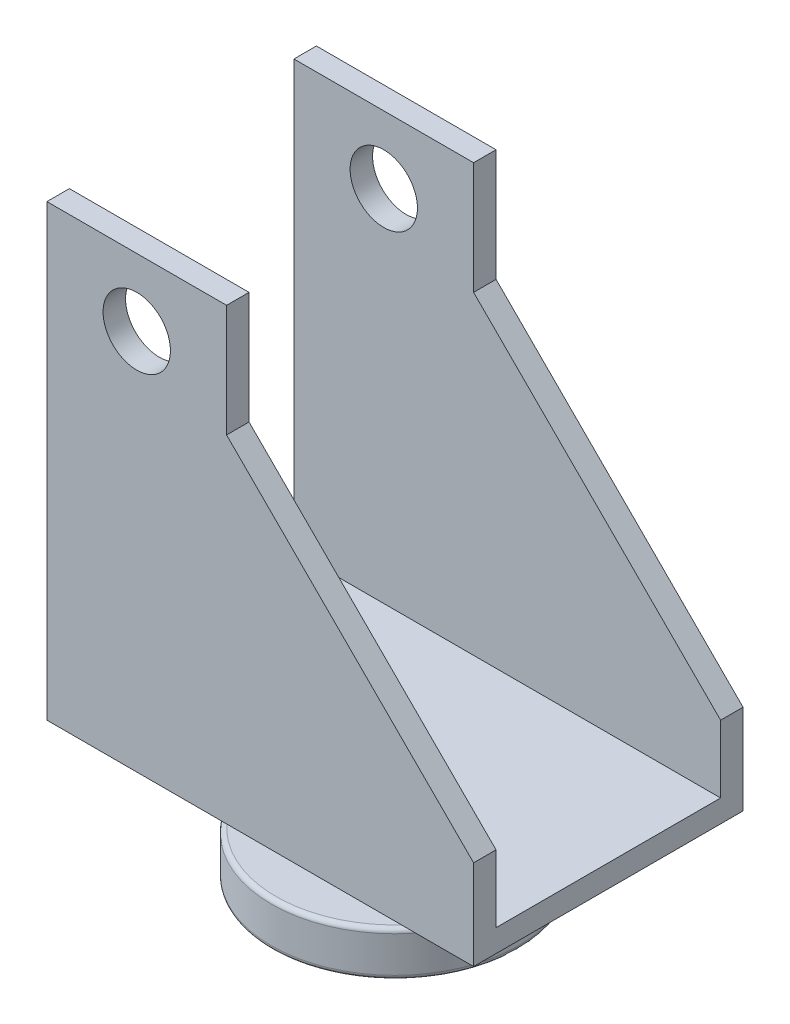
ISO-10303-21;
HEADER;
FILE_DESCRIPTION(('STEP AP214'),'2;1');
FILE_NAME('part.step','',(''),(''),'','','');
FILE_SCHEMA(('AUTOMOTIVE_DESIGN { 1 0 10303 214 1 1 1 1 }'));
ENDSEC;
DATA;
#1=APPLICATION_CONTEXT('core data for automotive mechanical design processes');
#2=APPLICATION_PROTOCOL_DEFINITION('international standard','automotive_design',2000,#1);
#3=PRODUCT_CONTEXT('',#1,'mechanical');
#4=PRODUCT('Part','Part','',(#3));
#5=PRODUCT_RELATED_PRODUCT_CATEGORY('part','',(#4));
#6=PRODUCT_DEFINITION_FORMATION('','',#4);
#7=PRODUCT_DEFINITION_CONTEXT('part definition',#1,'design');
#8=PRODUCT_DEFINITION('design','',#6,#7);
#9=PRODUCT_DEFINITION_SHAPE('','',#8);
#10=(LENGTH_UNIT() NAMED_UNIT(*) SI_UNIT(.MILLI.,.METRE.));
#11=(NAMED_UNIT(*) PLANE_ANGLE_UNIT() SI_UNIT($,.RADIAN.));
#12=(NAMED_UNIT(*) SI_UNIT($,.STERADIAN.) SOLID_ANGLE_UNIT());
#13=UNCERTAINTY_MEASURE_WITH_UNIT(LENGTH_MEASURE(1.E-05),#10,'distance_accuracy_value','');
#14=(GEOMETRIC_REPRESENTATION_CONTEXT(3) GLOBAL_UNCERTAINTY_ASSIGNED_CONTEXT((#13)) GLOBAL_UNIT_ASSIGNED_CONTEXT((#10,
#11,#12)) REPRESENTATION_CONTEXT('',''));
#15=CARTESIAN_POINT('',(0.,0.,0.));
#16=DIRECTION('',(0.,0.,1.));
#17=DIRECTION('',(1.,0.,0.));
#18=AXIS2_PLACEMENT_3D('',#15,#16,#17);
#19=CARTESIAN_POINT('',(0.,100.,30.));
#20=DIRECTION('',(0.,-1.,0.));
#21=DIRECTION('',(0.,0.,-1.));
#22=AXIS2_PLACEMENT_3D('',#19,#20,#21);
#23=PLANE('',#22);
#24=DIRECTION('',(-1.,0.,0.));
#25=VECTOR('',#24,1.);
#26=CARTESIAN_POINT('',(0.,100.,-25.));
#27=LINE('',#26,#25);
#28=CARTESIAN_POINT('',(40.,100.,-25.));
#29=VERTEX_POINT('',#28);
#30=CARTESIAN_POINT('',(0.,100.,-25.));
#31=VERTEX_POINT('',#30);
#32=EDGE_CURVE('E450',#29,#31,#27,.T.);
#33=ORIENTED_EDGE('',*,*,#32,.F.);
#34=DIRECTION('',(0.,0.,-1.));
#35=VECTOR('',#34,1.);
#36=CARTESIAN_POINT('',(40.,100.,30.));
#37=LINE('',#36,#35);
#38=CARTESIAN_POINT('',(40.,100.,-30.));
#39=VERTEX_POINT('',#38);
#40=EDGE_CURVE('E84',#29,#39,#37,.T.);
#41=ORIENTED_EDGE('',*,*,#40,.T.);
#42=DIRECTION('',(-1.,0.,0.));
#43=VECTOR('',#42,1.);
#44=CARTESIAN_POINT('',(0.,100.,-30.));
#45=LINE('',#44,#43);
#46=CARTESIAN_POINT('',(0.,100.,-30.));
#47=VERTEX_POINT('',#46);
#48=EDGE_CURVE('E136',#39,#47,#45,.T.);
#49=ORIENTED_EDGE('',*,*,#48,.T.);
#50=DIRECTION('',(0.,0.,-1.));
#51=VECTOR('',#50,1.);
#52=CARTESIAN_POINT('',(0.,100.,30.));
#53=LINE('',#52,#51);
#54=EDGE_CURVE('E161',#31,#47,#53,.T.);
#55=ORIENTED_EDGE('',*,*,#54,.F.);
#56=EDGE_LOOP('',(#33,#41,#49,#55));
#57=FACE_BOUND('',#56,.T.);
#58=ADVANCED_FACE('F32',(#57),#23,.F.);
#59=CARTESIAN_POINT('',(0.,0.,30.));
#60=DIRECTION('',(1.,0.,0.));
#61=DIRECTION('',(0.,0.,-1.));
#62=AXIS2_PLACEMENT_3D('',#59,#60,#61);
#63=PLANE('',#62);
#64=DIRECTION('',(0.,-1.,0.));
#65=VECTOR('',#64,1.);
#66=CARTESIAN_POINT('',(0.,0.,-25.));
#67=LINE('',#66,#65);
#68=CARTESIAN_POINT('',(0.,5.,-25.));
#69=VERTEX_POINT('',#68);
#70=EDGE_CURVE('E452',#31,#69,#67,.T.);
#71=ORIENTED_EDGE('',*,*,#70,.F.);
#72=ORIENTED_EDGE('',*,*,#54,.T.);
#73=DIRECTION('',(0.,-1.,0.));
#74=VECTOR('',#73,1.);
#75=CARTESIAN_POINT('',(0.,0.,-30.));
#76=LINE('',#75,#74);
#77=CARTESIAN_POINT('',(0.,0.,-30.));
#78=VERTEX_POINT('',#77);
#79=EDGE_CURVE('E138',#47,#78,#76,.T.);
#80=ORIENTED_EDGE('',*,*,#79,.T.);
#81=DIRECTION('',(0.,0.,-1.));
#82=VECTOR('',#81,1.);
#83=CARTESIAN_POINT('',(0.,0.,30.));
#84=LINE('',#83,#82);
#85=CARTESIAN_POINT('',(0.,0.,30.));
#86=VERTEX_POINT('',#85);
#87=EDGE_CURVE('E158',#86,#78,#84,.T.);
#88=ORIENTED_EDGE('',*,*,#87,.F.);
#89=DIRECTION('',(0.,-1.,0.));
#90=VECTOR('',#89,1.);
#91=CARTESIAN_POINT('',(0.,0.,30.));
#92=LINE('',#91,#90);
#93=CARTESIAN_POINT('',(0.,100.,30.));
#94=VERTEX_POINT('',#93);
#95=EDGE_CURVE('E93',#94,#86,#92,.T.);
#96=ORIENTED_EDGE('',*,*,#95,.F.);
#97=CARTESIAN_POINT('',(0.,100.,25.));
#98=VERTEX_POINT('',#97);
#99=EDGE_CURVE('E162',#94,#98,#53,.T.);
#100=ORIENTED_EDGE('',*,*,#99,.T.);
#101=DIRECTION('',(0.,-1.,0.));
#102=VECTOR('',#101,1.);
#103=CARTESIAN_POINT('',(0.,0.,25.));
#104=LINE('',#103,#102);
#105=CARTESIAN_POINT('',(0.,5.,25.));
#106=VERTEX_POINT('',#105);
#107=EDGE_CURVE('E285',#98,#106,#104,.T.);
#108=ORIENTED_EDGE('',*,*,#107,.T.);
#109=DIRECTION('',(0.,0.,-1.));
#110=VECTOR('',#109,1.);
#111=CARTESIAN_POINT('',(0.,5.,30.));
#112=LINE('',#111,#110);
#113=EDGE_CURVE('E139',#106,#69,#112,.T.);
#114=ORIENTED_EDGE('',*,*,#113,.T.);
#115=EDGE_LOOP('',(#71,#72,#80,#88,#96,#100,#108,#114));
#116=FACE_BOUND('',#115,.T.);
#117=ADVANCED_FACE('F199',(#116),#63,.F.);
#118=CARTESIAN_POINT('',(95.0000000000002,0.,30.));
#119=DIRECTION('',(-1.,0.,0.));
#120=DIRECTION('',(0.,-1.,0.));
#121=AXIS2_PLACEMENT_3D('',#118,#119,#120);
#122=PLANE('',#121);
#123=DIRECTION('',(0.,1.,0.));
#124=VECTOR('',#123,1.);
#125=CARTESIAN_POINT('',(95.0000000000002,0.,-25.));
#126=LINE('',#125,#124);
#127=CARTESIAN_POINT('',(95.0000000000002,5.,-25.));
#128=VERTEX_POINT('',#127);
#129=CARTESIAN_POINT('',(95.0000000000002,20.,-25.));
#130=VERTEX_POINT('',#129);
#131=EDGE_CURVE('E258',#128,#130,#126,.T.);
#132=ORIENTED_EDGE('',*,*,#131,.F.);
#133=DIRECTION('',(0.,0.,-1.));
#134=VECTOR('',#133,1.);
#135=CARTESIAN_POINT('',(95.0000000000002,5.,30.));
#136=LINE('',#135,#134);
#137=CARTESIAN_POINT('',(95.0000000000002,5.,25.));
#138=VERTEX_POINT('',#137);
#139=EDGE_CURVE('E226',#138,#128,#136,.T.);
#140=ORIENTED_EDGE('',*,*,#139,.F.);
#141=DIRECTION('',(0.,1.,0.));
#142=VECTOR('',#141,1.);
#143=CARTESIAN_POINT('',(95.0000000000002,0.,25.));
#144=LINE('',#143,#142);
#145=CARTESIAN_POINT('',(95.0000000000002,20.,25.));
#146=VERTEX_POINT('',#145);
#147=EDGE_CURVE('E123',#138,#146,#144,.T.);
#148=ORIENTED_EDGE('',*,*,#147,.T.);
#149=DIRECTION('',(0.,0.,-1.));
#150=VECTOR('',#149,1.);
#151=CARTESIAN_POINT('',(95.0000000000002,20.,30.));
#152=LINE('',#151,#150);
#153=CARTESIAN_POINT('',(95.0000000000002,20.,30.));
#154=VERTEX_POINT('',#153);
#155=EDGE_CURVE('E117',#154,#146,#152,.T.);
#156=ORIENTED_EDGE('',*,*,#155,.F.);
#157=DIRECTION('',(0.,1.,0.));
#158=VECTOR('',#157,1.);
#159=CARTESIAN_POINT('',(95.0000000000002,0.,30.));
#160=LINE('',#159,#158);
#161=CARTESIAN_POINT('',(95.0000000000002,0.,30.));
#162=VERTEX_POINT('',#161);
#163=EDGE_CURVE('E103',#162,#154,#160,.T.);
#164=ORIENTED_EDGE('',*,*,#163,.F.);
#165=DIRECTION('',(0.,0.,-1.));
#166=VECTOR('',#165,1.);
#167=CARTESIAN_POINT('',(95.0000000000002,0.,30.));
#168=LINE('',#167,#166);
#169=CARTESIAN_POINT('',(95.0000000000002,0.,-30.));
#170=VERTEX_POINT('',#169);
#171=EDGE_CURVE('E126',#162,#170,#168,.T.);
#172=ORIENTED_EDGE('',*,*,#171,.T.);
#173=DIRECTION('',(0.,1.,0.));
#174=VECTOR('',#173,1.);
#175=CARTESIAN_POINT('',(95.0000000000002,0.,-30.));
#176=LINE('',#175,#174);
#177=CARTESIAN_POINT('',(95.0000000000002,20.,-30.));
#178=VERTEX_POINT('',#177);
#179=EDGE_CURVE('E143',#170,#178,#176,.T.);
#180=ORIENTED_EDGE('',*,*,#179,.T.);
#181=EDGE_CURVE('E127',#130,#178,#152,.T.);
#182=ORIENTED_EDGE('',*,*,#181,.F.);
#183=EDGE_LOOP('',(#132,#140,#148,#156,#164,#172,#180,#182));
#184=FACE_BOUND('',#183,.T.);
#185=ADVANCED_FACE('F119',(#184),#122,.F.);
#186=CARTESIAN_POINT('',(57.4999999999999,57.5000000000002,30.));
#187=DIRECTION('',(-0.707106781186546,-0.707106781186549,0.));
#188=DIRECTION('',(0.707106781186549,-0.707106781186546,0.));
#189=AXIS2_PLACEMENT_3D('',#186,#187,#188);
#190=PLANE('',#189);
#191=DIRECTION('',(-0.707106781186549,0.707106781186546,0.));
#192=VECTOR('',#191,1.);
#193=CARTESIAN_POINT('',(57.4999999999999,57.5000000000002,-25.));
#194=LINE('',#193,#192);
#195=CARTESIAN_POINT('',(40.,75.,-25.));
#196=VERTEX_POINT('',#195);
#197=EDGE_CURVE('E255',#130,#196,#194,.T.);
#198=ORIENTED_EDGE('',*,*,#197,.F.);
#199=ORIENTED_EDGE('',*,*,#181,.T.);
#200=DIRECTION('',(-0.707106781186549,0.707106781186546,0.));
#201=VECTOR('',#200,1.);
#202=CARTESIAN_POINT('',(57.4999999999999,57.5000000000002,-30.));
#203=LINE('',#202,#201);
#204=CARTESIAN_POINT('',(40.,75.,-30.));
#205=VERTEX_POINT('',#204);
#206=EDGE_CURVE('E146',#178,#205,#203,.T.);
#207=ORIENTED_EDGE('',*,*,#206,.T.);
#208=DIRECTION('',(0.,0.,-1.));
#209=VECTOR('',#208,1.);
#210=CARTESIAN_POINT('',(40.,75.,30.));
#211=LINE('',#210,#209);
#212=EDGE_CURVE('E155',#196,#205,#211,.T.);
#213=ORIENTED_EDGE('',*,*,#212,.F.);
#214=EDGE_LOOP('',(#198,#199,#207,#213));
#215=FACE_BOUND('',#214,.T.);
#216=ADVANCED_FACE('F216',(#215),#190,.F.);
#217=CARTESIAN_POINT('',(40.,0.,30.));
#218=DIRECTION('',(-1.,0.,0.));
#219=DIRECTION('',(0.,0.,1.));
#220=AXIS2_PLACEMENT_3D('',#217,#218,#219);
#221=PLANE('',#220);
#222=DIRECTION('',(0.,1.,0.));
#223=VECTOR('',#222,1.);
#224=CARTESIAN_POINT('',(40.,0.,-25.));
#225=LINE('',#224,#223);
#226=EDGE_CURVE('E456',#196,#29,#225,.T.);
#227=ORIENTED_EDGE('',*,*,#226,.F.);
#228=ORIENTED_EDGE('',*,*,#212,.T.);
#229=DIRECTION('',(0.,1.,0.));
#230=VECTOR('',#229,1.);
#231=CARTESIAN_POINT('',(40.,0.,-30.));
#232=LINE('',#231,#230);
#233=EDGE_CURVE('E149',#205,#39,#232,.T.);
#234=ORIENTED_EDGE('',*,*,#233,.T.);
#235=ORIENTED_EDGE('',*,*,#40,.F.);
#236=EDGE_LOOP('',(#227,#228,#234,#235));
#237=FACE_BOUND('',#236,.T.);
#238=ADVANCED_FACE('F208',(#237),#221,.F.);
#239=CARTESIAN_POINT('',(40.,100.,30.));
#240=VERTEX_POINT('',#239);
#241=CARTESIAN_POINT('',(40.,100.,25.));
#242=VERTEX_POINT('',#241);
#243=EDGE_CURVE('E152',#240,#242,#37,.T.);
#244=ORIENTED_EDGE('',*,*,#243,.T.);
#245=DIRECTION('',(-1.,0.,0.));
#246=VECTOR('',#245,1.);
#247=CARTESIAN_POINT('',(0.,100.,25.));
#248=LINE('',#247,#246);
#249=EDGE_CURVE('E47',#242,#98,#248,.T.);
#250=ORIENTED_EDGE('',*,*,#249,.T.);
#251=ORIENTED_EDGE('',*,*,#99,.F.);
#252=DIRECTION('',(-1.,0.,0.));
#253=VECTOR('',#252,1.);
#254=CARTESIAN_POINT('',(0.,100.,30.));
#255=LINE('',#254,#253);
#256=EDGE_CURVE('E151',#240,#94,#255,.T.);
#257=ORIENTED_EDGE('',*,*,#256,.F.);
#258=EDGE_LOOP('',(#244,#250,#251,#257));
#259=FACE_BOUND('',#258,.T.);
#260=ADVANCED_FACE('F201',(#259),#23,.F.);
#261=CARTESIAN_POINT('',(0.,0.,30.));
#262=DIRECTION('',(0.,1.,0.));
#263=DIRECTION('',(0.,0.,1.));
#264=AXIS2_PLACEMENT_3D('',#261,#262,#263);
#265=PLANE('',#264);
#266=CARTESIAN_POINT('',(47.5000000000001,0.,0.));
#267=DIRECTION('',(0.,-1.,0.));
#268=DIRECTION('',(0.,0.,-1.));
#269=AXIS2_PLACEMENT_3D('',#266,#267,#268);
#270=CIRCLE('',#269,15.);
#271=CARTESIAN_POINT('',(47.5000000000001,0.,-15.));
#272=VERTEX_POINT('',#271);
#273=EDGE_CURVE('E164',#272,#272,#270,.T.);
#274=ORIENTED_EDGE('',*,*,#273,.F.);
#275=EDGE_LOOP('',(#274));
#276=FACE_BOUND('',#275,.T.);
#277=DIRECTION('',(1.,0.,0.));
#278=VECTOR('',#277,1.);
#279=CARTESIAN_POINT('',(0.,0.,-30.));
#280=LINE('',#279,#278);
#281=EDGE_CURVE('E141',#78,#170,#280,.T.);
#282=ORIENTED_EDGE('',*,*,#281,.T.);
#283=ORIENTED_EDGE('',*,*,#171,.F.);
#284=DIRECTION('',(1.,0.,0.));
#285=VECTOR('',#284,1.);
#286=CARTESIAN_POINT('',(0.,0.,30.));
#287=LINE('',#286,#285);
#288=EDGE_CURVE('E110',#86,#162,#287,.T.);
#289=ORIENTED_EDGE('',*,*,#288,.F.);
#290=ORIENTED_EDGE('',*,*,#87,.T.);
#291=EDGE_LOOP('',(#282,#283,#289,#290));
#292=FACE_BOUND('',#291,.T.);
#293=ADVANCED_FACE('F207',(#276,#292),#265,.F.);
#294=ORIENTED_EDGE('',*,*,#155,.T.);
#295=DIRECTION('',(-0.707106781186549,0.707106781186546,0.));
#296=VECTOR('',#295,1.);
#297=CARTESIAN_POINT('',(57.4999999999999,57.5000000000002,25.));
#298=LINE('',#297,#296);
#299=CARTESIAN_POINT('',(40.,75.,25.));
#300=VERTEX_POINT('',#299);
#301=EDGE_CURVE('E227',#146,#300,#298,.T.);
#302=ORIENTED_EDGE('',*,*,#301,.T.);
#303=CARTESIAN_POINT('',(40.,75.,30.));
#304=VERTEX_POINT('',#303);
#305=EDGE_CURVE('E131',#304,#300,#211,.T.);
#306=ORIENTED_EDGE('',*,*,#305,.F.);
#307=DIRECTION('',(-0.707106781186549,0.707106781186546,0.));
#308=VECTOR('',#307,1.);
#309=CARTESIAN_POINT('',(57.4999999999999,57.5000000000002,30.));
#310=LINE('',#309,#308);
#311=EDGE_CURVE('E107',#154,#304,#310,.T.);
#312=ORIENTED_EDGE('',*,*,#311,.F.);
#313=EDGE_LOOP('',(#294,#302,#306,#312));
#314=FACE_BOUND('',#313,.T.);
#315=ADVANCED_FACE('F129',(#314),#190,.F.);
#316=ORIENTED_EDGE('',*,*,#305,.T.);
#317=DIRECTION('',(0.,1.,0.));
#318=VECTOR('',#317,1.);
#319=CARTESIAN_POINT('',(40.,0.,25.));
#320=LINE('',#319,#318);
#321=EDGE_CURVE('E224',#300,#242,#320,.T.);
#322=ORIENTED_EDGE('',*,*,#321,.T.);
#323=ORIENTED_EDGE('',*,*,#243,.F.);
#324=DIRECTION('',(0.,1.,0.));
#325=VECTOR('',#324,1.);
#326=CARTESIAN_POINT('',(40.,0.,30.));
#327=LINE('',#326,#325);
#328=EDGE_CURVE('E56',#304,#240,#327,.T.);
#329=ORIENTED_EDGE('',*,*,#328,.F.);
#330=EDGE_LOOP('',(#316,#322,#323,#329));
#331=FACE_BOUND('',#330,.T.);
#332=ADVANCED_FACE('F219',(#331),#221,.F.);
#333=CARTESIAN_POINT('',(0.,0.,30.));
#334=DIRECTION('',(0.,0.,1.));
#335=DIRECTION('',(1.,0.,0.));
#336=AXIS2_PLACEMENT_3D('',#333,#334,#335);
#337=PLANE('',#336);
#338=CARTESIAN_POINT('',(20.,85.,30.));
#339=DIRECTION('',(0.,0.,1.));
#340=DIRECTION('',(1.,0.,0.));
#341=AXIS2_PLACEMENT_3D('',#338,#339,#340);
#342=CIRCLE('',#341,7.5);
#343=CARTESIAN_POINT('',(27.5,85.,30.));
#344=VERTEX_POINT('',#343);
#345=EDGE_CURVE('E440',#344,#344,#342,.T.);
#346=ORIENTED_EDGE('',*,*,#345,.F.);
#347=EDGE_LOOP('',(#346));
#348=FACE_BOUND('',#347,.T.);
#349=ORIENTED_EDGE('',*,*,#256,.T.);
#350=ORIENTED_EDGE('',*,*,#95,.T.);
#351=ORIENTED_EDGE('',*,*,#288,.T.);
#352=ORIENTED_EDGE('',*,*,#163,.T.);
#353=ORIENTED_EDGE('',*,*,#311,.T.);
#354=ORIENTED_EDGE('',*,*,#328,.T.);
#355=EDGE_LOOP('',(#349,#350,#351,#352,#353,#354));
#356=FACE_BOUND('',#355,.T.);
#357=ADVANCED_FACE('F105',(#348,#356),#337,.T.);
#358=CARTESIAN_POINT('',(0.,0.,-30.));
#359=DIRECTION('',(0.,0.,1.));
#360=DIRECTION('',(1.,0.,0.));
#361=AXIS2_PLACEMENT_3D('',#358,#359,#360);
#362=PLANE('',#361);
#363=CARTESIAN_POINT('',(20.,85.,-30.));
#364=DIRECTION('',(0.,0.,1.));
#365=DIRECTION('',(1.,0.,0.));
#366=AXIS2_PLACEMENT_3D('',#363,#364,#365);
#367=CIRCLE('',#366,7.5);
#368=CARTESIAN_POINT('',(27.5,85.,-30.));
#369=VERTEX_POINT('',#368);
#370=EDGE_CURVE('E169',#369,#369,#367,.T.);
#371=ORIENTED_EDGE('',*,*,#370,.T.);
#372=EDGE_LOOP('',(#371));
#373=FACE_BOUND('',#372,.T.);
#374=ORIENTED_EDGE('',*,*,#48,.F.);
#375=ORIENTED_EDGE('',*,*,#233,.F.);
#376=ORIENTED_EDGE('',*,*,#206,.F.);
#377=ORIENTED_EDGE('',*,*,#179,.F.);
#378=ORIENTED_EDGE('',*,*,#281,.F.);
#379=ORIENTED_EDGE('',*,*,#79,.F.);
#380=EDGE_LOOP('',(#374,#375,#376,#377,#378,#379));
#381=FACE_BOUND('',#380,.T.);
#382=ADVANCED_FACE('F247',(#373,#381),#362,.F.);
#383=CARTESIAN_POINT('',(0.,5.,30.));
#384=DIRECTION('',(0.,1.,0.));
#385=DIRECTION('',(0.,0.,1.));
#386=AXIS2_PLACEMENT_3D('',#383,#384,#385);
#387=PLANE('',#386);
#388=DIRECTION('',(1.,0.,0.));
#389=VECTOR('',#388,1.);
#390=CARTESIAN_POINT('',(0.,5.,-25.));
#391=LINE('',#390,#389);
#392=EDGE_CURVE('E451',#69,#128,#391,.T.);
#393=ORIENTED_EDGE('',*,*,#392,.F.);
#394=ORIENTED_EDGE('',*,*,#113,.F.);
#395=DIRECTION('',(1.,0.,0.));
#396=VECTOR('',#395,1.);
#397=CARTESIAN_POINT('',(0.,5.,25.));
#398=LINE('',#397,#396);
#399=EDGE_CURVE('E236',#106,#138,#398,.T.);
#400=ORIENTED_EDGE('',*,*,#399,.T.);
#401=ORIENTED_EDGE('',*,*,#139,.T.);
#402=EDGE_LOOP('',(#393,#394,#400,#401));
#403=FACE_BOUND('',#402,.T.);
#404=ADVANCED_FACE('F282',(#403),#387,.T.);
#405=CARTESIAN_POINT('',(0.,0.,25.));
#406=DIRECTION('',(0.,0.,1.));
#407=DIRECTION('',(1.,0.,0.));
#408=AXIS2_PLACEMENT_3D('',#405,#406,#407);
#409=PLANE('',#408);
#410=CARTESIAN_POINT('',(20.,85.,25.));
#411=DIRECTION('',(0.,0.,1.));
#412=DIRECTION('',(1.,0.,0.));
#413=AXIS2_PLACEMENT_3D('',#410,#411,#412);
#414=CIRCLE('',#413,7.5);
#415=CARTESIAN_POINT('',(27.5,85.,25.));
#416=VERTEX_POINT('',#415);
#417=EDGE_CURVE('E168',#416,#416,#414,.T.);
#418=ORIENTED_EDGE('',*,*,#417,.T.);
#419=EDGE_LOOP('',(#418));
#420=FACE_BOUND('',#419,.T.);
#421=ORIENTED_EDGE('',*,*,#249,.F.);
#422=ORIENTED_EDGE('',*,*,#321,.F.);
#423=ORIENTED_EDGE('',*,*,#301,.F.);
#424=ORIENTED_EDGE('',*,*,#147,.F.);
#425=ORIENTED_EDGE('',*,*,#399,.F.);
#426=ORIENTED_EDGE('',*,*,#107,.F.);
#427=EDGE_LOOP('',(#421,#422,#423,#424,#425,#426));
#428=FACE_BOUND('',#427,.T.);
#429=ADVANCED_FACE('F287',(#420,#428),#409,.F.);
#430=CARTESIAN_POINT('',(0.,0.,-25.));
#431=DIRECTION('',(0.,0.,1.));
#432=DIRECTION('',(1.,0.,0.));
#433=AXIS2_PLACEMENT_3D('',#430,#431,#432);
#434=PLANE('',#433);
#435=CARTESIAN_POINT('',(20.,85.,-25.));
#436=DIRECTION('',(0.,0.,1.));
#437=DIRECTION('',(1.,0.,0.));
#438=AXIS2_PLACEMENT_3D('',#435,#436,#437);
#439=CIRCLE('',#438,7.5);
#440=CARTESIAN_POINT('',(27.5,85.,-25.));
#441=VERTEX_POINT('',#440);
#442=EDGE_CURVE('E165',#441,#441,#439,.T.);
#443=ORIENTED_EDGE('',*,*,#442,.F.);
#444=EDGE_LOOP('',(#443));
#445=FACE_BOUND('',#444,.T.);
#446=ORIENTED_EDGE('',*,*,#32,.T.);
#447=ORIENTED_EDGE('',*,*,#70,.T.);
#448=ORIENTED_EDGE('',*,*,#392,.T.);
#449=ORIENTED_EDGE('',*,*,#131,.T.);
#450=ORIENTED_EDGE('',*,*,#197,.T.);
#451=ORIENTED_EDGE('',*,*,#226,.T.);
#452=EDGE_LOOP('',(#446,#447,#448,#449,#450,#451));
#453=FACE_BOUND('',#452,.T.);
#454=ADVANCED_FACE('F289',(#445,#453),#434,.T.);
#455=CARTESIAN_POINT('',(20.,85.,-30.));
#456=DIRECTION('',(0.,0.,1.));
#457=DIRECTION('',(1.,0.,0.));
#458=AXIS2_PLACEMENT_3D('',#455,#456,#457);
#459=CYLINDRICAL_SURFACE('',#458,7.5);
#460=ORIENTED_EDGE('',*,*,#442,.T.);
#461=EDGE_LOOP('',(#460));
#462=FACE_BOUND('',#461,.T.);
#463=ORIENTED_EDGE('',*,*,#370,.F.);
#464=EDGE_LOOP('',(#463));
#465=FACE_BOUND('',#464,.T.);
#466=ADVANCED_FACE('F296',(#462,#465),#459,.F.);
#467=ORIENTED_EDGE('',*,*,#345,.T.);
#468=EDGE_LOOP('',(#467));
#469=FACE_BOUND('',#468,.T.);
#470=ORIENTED_EDGE('',*,*,#417,.F.);
#471=EDGE_LOOP('',(#470));
#472=FACE_BOUND('',#471,.T.);
#473=ADVANCED_FACE('F377',(#469,#472),#459,.F.);
#474=CARTESIAN_POINT('',(47.5000000000001,-12.,0.));
#475=DIRECTION('',(0.,1.,0.));
#476=DIRECTION('',(0.,0.,1.));
#477=AXIS2_PLACEMENT_3D('',#474,#475,#476);
#478=CYLINDRICAL_SURFACE('',#477,15.);
#479=CARTESIAN_POINT('',(47.5000000000001,-12.,0.));
#480=DIRECTION('',(0.,-1.,0.));
#481=DIRECTION('',(0.,0.,-1.));
#482=AXIS2_PLACEMENT_3D('',#479,#480,#481);
#483=CIRCLE('',#482,15.);
#484=CARTESIAN_POINT('',(47.5000000000001,-12.,-15.));
#485=VERTEX_POINT('',#484);
#486=EDGE_CURVE('E439',#485,#485,#483,.T.);
#487=ORIENTED_EDGE('',*,*,#486,.F.);
#488=EDGE_LOOP('',(#487));
#489=FACE_BOUND('',#488,.T.);
#490=ORIENTED_EDGE('',*,*,#273,.T.);
#491=EDGE_LOOP('',(#490));
#492=FACE_BOUND('',#491,.T.);
#493=ADVANCED_FACE('F196',(#489,#492),#478,.T.);
#494=CARTESIAN_POINT('',(47.5000000000001,-22.,0.));
#495=DIRECTION('',(0.,1.,0.));
#496=DIRECTION('',(0.,0.,1.));
#497=AXIS2_PLACEMENT_3D('',#494,#495,#496);
#498=CYLINDRICAL_SURFACE('',#497,27.5);
#499=CARTESIAN_POINT('',(47.5000000000001,-21.,0.));
#500=DIRECTION('',(0.,-1.,0.));
#501=DIRECTION('',(0.,0.,-1.));
#502=AXIS2_PLACEMENT_3D('',#499,#500,#501);
#503=CIRCLE('',#502,27.5);
#504=CARTESIAN_POINT('',(47.5000000000001,-21.,-27.5));
#505=VERTEX_POINT('',#504);
#506=EDGE_CURVE('E40',#505,#505,#503,.F.);
#507=ORIENTED_EDGE('',*,*,#506,.T.);
#508=EDGE_LOOP('',(#507));
#509=FACE_BOUND('',#508,.T.);
#510=CARTESIAN_POINT('',(47.5000000000001,-13.,0.));
#511=DIRECTION('',(0.,-1.,0.));
#512=DIRECTION('',(0.,0.,-1.));
#513=AXIS2_PLACEMENT_3D('',#510,#511,#512);
#514=CIRCLE('',#513,27.5);
#515=CARTESIAN_POINT('',(47.5000000000001,-13.,-27.5));
#516=VERTEX_POINT('',#515);
#517=EDGE_CURVE('E173',#516,#516,#514,.T.);
#518=ORIENTED_EDGE('',*,*,#517,.T.);
#519=EDGE_LOOP('',(#518));
#520=FACE_BOUND('',#519,.T.);
#521=ADVANCED_FACE('F178',(#509,#520),#498,.T.);
#522=CARTESIAN_POINT('',(47.5000000000001,-22.,0.));
#523=DIRECTION('',(0.,-1.,0.));
#524=DIRECTION('',(0.,0.,-1.));
#525=AXIS2_PLACEMENT_3D('',#522,#523,#524);
#526=PLANE('',#525);
#527=CARTESIAN_POINT('',(47.5000000000001,-22.,0.));
#528=DIRECTION('',(0.,-1.,0.));
#529=DIRECTION('',(0.,0.,-1.));
#530=AXIS2_PLACEMENT_3D('',#527,#528,#529);
#531=CIRCLE('',#530,26.5);
#532=CARTESIAN_POINT('',(47.5000000000001,-22.,-26.5));
#533=VERTEX_POINT('',#532);
#534=EDGE_CURVE('E170',#533,#533,#531,.T.);
#535=ORIENTED_EDGE('',*,*,#534,.T.);
#536=EDGE_LOOP('',(#535));
#537=FACE_BOUND('',#536,.T.);
#538=ADVANCED_FACE('F187',(#537),#526,.T.);
#539=CARTESIAN_POINT('',(47.5000000000001,-12.,0.));
#540=DIRECTION('',(0.,-1.,0.));
#541=DIRECTION('',(0.,0.,-1.));
#542=AXIS2_PLACEMENT_3D('',#539,#540,#541);
#543=PLANE('',#542);
#544=CARTESIAN_POINT('',(47.5000000000001,-12.,0.));
#545=DIRECTION('',(0.,-1.,0.));
#546=DIRECTION('',(0.,0.,-1.));
#547=AXIS2_PLACEMENT_3D('',#544,#545,#546);
#548=CIRCLE('',#547,26.5);
#549=CARTESIAN_POINT('',(47.5000000000001,-12.,-26.5));
#550=VERTEX_POINT('',#549);
#551=EDGE_CURVE('E11',#550,#550,#548,.F.);
#552=ORIENTED_EDGE('',*,*,#551,.T.);
#553=EDGE_LOOP('',(#552));
#554=FACE_BOUND('',#553,.T.);
#555=ORIENTED_EDGE('',*,*,#486,.T.);
#556=EDGE_LOOP('',(#555));
#557=FACE_BOUND('',#556,.T.);
#558=ADVANCED_FACE('F184',(#554,#557),#543,.F.);
#559=CARTESIAN_POINT('',(47.5000000000001,-21.,0.));
#560=DIRECTION('',(0.,-1.,0.));
#561=DIRECTION('',(0.,0.,-1.));
#562=AXIS2_PLACEMENT_3D('',#559,#560,#561);
#563=TOROIDAL_SURFACE('',#562,26.5,1.);
#564=ORIENTED_EDGE('',*,*,#506,.F.);
#565=EDGE_LOOP('',(#564));
#566=FACE_BOUND('',#565,.T.);
#567=ORIENTED_EDGE('',*,*,#534,.F.);
#568=EDGE_LOOP('',(#567));
#569=FACE_BOUND('',#568,.T.);
#570=ADVANCED_FACE('F181',(#566,#569),#563,.T.);
#571=CARTESIAN_POINT('',(47.5000000000001,-13.,0.));
#572=DIRECTION('',(0.,-1.,0.));
#573=DIRECTION('',(0.,0.,-1.));
#574=AXIS2_PLACEMENT_3D('',#571,#572,#573);
#575=TOROIDAL_SURFACE('',#574,26.5,1.);
#576=ORIENTED_EDGE('',*,*,#551,.F.);
#577=EDGE_LOOP('',(#576));
#578=FACE_BOUND('',#577,.T.);
#579=ORIENTED_EDGE('',*,*,#517,.F.);
#580=EDGE_LOOP('',(#579));
#581=FACE_BOUND('',#580,.T.);
#582=ADVANCED_FACE('F34',(#578,#581),#575,.T.);
#583=CLOSED_SHELL('',(#58,#117,#185,#216,#238,#260,#293,#315,#332,#357,#382,#404,#429,#454,#466,
#473,#493,#521,#538,#558,#570,#582));
#584=MANIFOLD_SOLID_BREP('B2',#583);
#585=ADVANCED_BREP_SHAPE_REPRESENTATION('',(#18,#584),#14);
#586=SHAPE_DEFINITION_REPRESENTATION(#9,#585);
ENDSEC;
END-ISO-10303-21;
